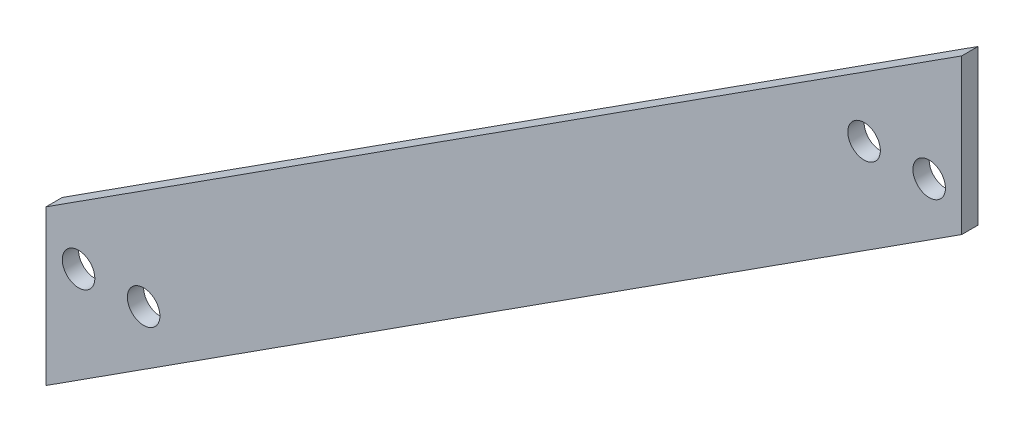
ISO-10303-21;
HEADER;
FILE_DESCRIPTION(('STEP AP214'),'2;1');
FILE_NAME('part.step','',(''),(''),'','','');
FILE_SCHEMA(('AUTOMOTIVE_DESIGN { 1 0 10303 214 1 1 1 1 }'));
ENDSEC;
DATA;
#1=APPLICATION_CONTEXT('core data for automotive mechanical design processes');
#2=APPLICATION_PROTOCOL_DEFINITION('international standard','automotive_design',2000,#1);
#3=PRODUCT_CONTEXT('',#1,'mechanical');
#4=PRODUCT('Part','Part','',(#3));
#5=PRODUCT_RELATED_PRODUCT_CATEGORY('part','',(#4));
#6=PRODUCT_DEFINITION_FORMATION('','',#4);
#7=PRODUCT_DEFINITION_CONTEXT('part definition',#1,'design');
#8=PRODUCT_DEFINITION('design','',#6,#7);
#9=PRODUCT_DEFINITION_SHAPE('','',#8);
#10=(LENGTH_UNIT() NAMED_UNIT(*) SI_UNIT(.MILLI.,.METRE.));
#11=(NAMED_UNIT(*) PLANE_ANGLE_UNIT() SI_UNIT($,.RADIAN.));
#12=(NAMED_UNIT(*) SI_UNIT($,.STERADIAN.) SOLID_ANGLE_UNIT());
#13=UNCERTAINTY_MEASURE_WITH_UNIT(LENGTH_MEASURE(1.E-05),#10,'distance_accuracy_value','');
#14=(GEOMETRIC_REPRESENTATION_CONTEXT(3) GLOBAL_UNCERTAINTY_ASSIGNED_CONTEXT((#13)) GLOBAL_UNIT_ASSIGNED_CONTEXT((#10,
#11,#12)) REPRESENTATION_CONTEXT('',''));
#15=CARTESIAN_POINT('',(0.,0.,0.));
#16=DIRECTION('',(0.,0.,1.));
#17=DIRECTION('',(1.,0.,0.));
#18=AXIS2_PLACEMENT_3D('',#15,#16,#17);
#19=CARTESIAN_POINT('',(0.,0.,4.7625));
#20=DIRECTION('',(0.,0.,1.));
#21=DIRECTION('',(1.,0.,0.));
#22=AXIS2_PLACEMENT_3D('',#19,#20,#21);
#23=PLANE('',#22);
#24=CARTESIAN_POINT('',(239.395,136.318636406188,4.7625));
#25=DIRECTION('',(0.,0.,1.));
#26=DIRECTION('',(1.,0.,0.));
#27=AXIS2_PLACEMENT_3D('',#24,#25,#26);
#28=CIRCLE('',#27,4.76250000000001);
#29=CARTESIAN_POINT('',(234.6325,136.318636406188,4.7625));
#30=VERTEX_POINT('',#29);
#31=EDGE_CURVE('E156',#30,#30,#28,.T.);
#32=ORIENTED_EDGE('',*,*,#31,.F.);
#33=EDGE_LOOP('',(#32));
#34=FACE_BOUND('',#33,.T.);
#35=CARTESIAN_POINT('',(9.525,-11.0013635938122,4.7625));
#36=DIRECTION('',(0.,0.,1.));
#37=DIRECTION('',(1.,0.,0.));
#38=AXIS2_PLACEMENT_3D('',#35,#36,#37);
#39=CIRCLE('',#38,4.76250000000001);
#40=CARTESIAN_POINT('',(4.76249999999999,-11.0013635938122,4.7625));
#41=VERTEX_POINT('',#40);
#42=EDGE_CURVE('E122',#41,#41,#39,.T.);
#43=ORIENTED_EDGE('',*,*,#42,.F.);
#44=EDGE_LOOP('',(#43));
#45=FACE_BOUND('',#44,.T.);
#46=DIRECTION('',(-0.841219980517551,-0.540693022313079,0.));
#47=VECTOR('',#46,1.);
#48=CARTESIAN_POINT('',(267.97,172.237360672406,4.7625));
#49=LINE('',#48,#47);
#50=CARTESIAN_POINT('',(267.97,172.237360672406,4.7625));
#51=VERTEX_POINT('',#50);
#52=CARTESIAN_POINT('',(0.,0.,4.7625));
#53=VERTEX_POINT('',#52);
#54=EDGE_CURVE('E100',#51,#53,#49,.T.);
#55=ORIENTED_EDGE('',*,*,#54,.T.);
#56=DIRECTION('',(0.,-1.,0.));
#57=VECTOR('',#56,1.);
#58=CARTESIAN_POINT('',(0.,0.,4.7625));
#59=LINE('',#58,#57);
#60=CARTESIAN_POINT('',(0.,-45.2913635938107,4.7625));
#61=VERTEX_POINT('',#60);
#62=EDGE_CURVE('E95',#53,#61,#59,.T.);
#63=ORIENTED_EDGE('',*,*,#62,.T.);
#64=DIRECTION('',(0.84121998051755,0.540693022313081,0.));
#65=VECTOR('',#64,1.);
#66=CARTESIAN_POINT('',(0.,-45.2913635938107,4.7625));
#67=LINE('',#66,#65);
#68=CARTESIAN_POINT('',(267.97,126.945997078596,4.7625));
#69=VERTEX_POINT('',#68);
#70=EDGE_CURVE('E98',#61,#69,#67,.T.);
#71=ORIENTED_EDGE('',*,*,#70,.T.);
#72=DIRECTION('',(0.,1.,0.));
#73=VECTOR('',#72,1.);
#74=CARTESIAN_POINT('',(267.97,126.945997078596,4.7625));
#75=LINE('',#74,#73);
#76=EDGE_CURVE('E65',#69,#51,#75,.T.);
#77=ORIENTED_EDGE('',*,*,#76,.T.);
#78=EDGE_LOOP('',(#55,#63,#71,#77));
#79=FACE_BOUND('',#78,.T.);
#80=CARTESIAN_POINT('',(28.575,-11.0013635938122,4.7625));
#81=DIRECTION('',(0.,0.,1.));
#82=DIRECTION('',(1.,0.,0.));
#83=AXIS2_PLACEMENT_3D('',#80,#81,#82);
#84=CIRCLE('',#83,4.76250000000001);
#85=CARTESIAN_POINT('',(23.8125,-11.0013635938122,4.7625));
#86=VERTEX_POINT('',#85);
#87=EDGE_CURVE('E148',#86,#86,#84,.T.);
#88=ORIENTED_EDGE('',*,*,#87,.F.);
#89=EDGE_LOOP('',(#88));
#90=FACE_BOUND('',#89,.T.);
#91=CARTESIAN_POINT('',(258.445,136.318636406188,4.7625));
#92=DIRECTION('',(0.,0.,1.));
#93=DIRECTION('',(1.,0.,0.));
#94=AXIS2_PLACEMENT_3D('',#91,#92,#93);
#95=CIRCLE('',#94,4.76250000000001);
#96=CARTESIAN_POINT('',(253.6825,136.318636406188,4.7625));
#97=VERTEX_POINT('',#96);
#98=EDGE_CURVE('E164',#97,#97,#95,.T.);
#99=ORIENTED_EDGE('',*,*,#98,.F.);
#100=EDGE_LOOP('',(#99));
#101=FACE_BOUND('',#100,.T.);
#102=ADVANCED_FACE('F47',(#34,#45,#79,#90,#101),#23,.T.);
#103=CARTESIAN_POINT('',(0.,0.,0.));
#104=DIRECTION('',(0.,0.,1.));
#105=DIRECTION('',(1.,0.,0.));
#106=AXIS2_PLACEMENT_3D('',#103,#104,#105);
#107=PLANE('',#106);
#108=DIRECTION('',(-0.841219980517551,-0.540693022313079,0.));
#109=VECTOR('',#108,1.);
#110=CARTESIAN_POINT('',(267.97,172.237360672406,0.));
#111=LINE('',#110,#109);
#112=CARTESIAN_POINT('',(267.97,172.237360672406,0.));
#113=VERTEX_POINT('',#112);
#114=CARTESIAN_POINT('',(0.,0.,0.));
#115=VERTEX_POINT('',#114);
#116=EDGE_CURVE('E118',#113,#115,#111,.T.);
#117=ORIENTED_EDGE('',*,*,#116,.F.);
#118=DIRECTION('',(0.,1.,0.));
#119=VECTOR('',#118,1.);
#120=CARTESIAN_POINT('',(267.97,126.945997078596,0.));
#121=LINE('',#120,#119);
#122=CARTESIAN_POINT('',(267.97,126.945997078596,0.));
#123=VERTEX_POINT('',#122);
#124=EDGE_CURVE('E88',#123,#113,#121,.T.);
#125=ORIENTED_EDGE('',*,*,#124,.F.);
#126=DIRECTION('',(0.84121998051755,0.540693022313081,0.));
#127=VECTOR('',#126,1.);
#128=CARTESIAN_POINT('',(0.,-45.2913635938107,0.));
#129=LINE('',#128,#127);
#130=CARTESIAN_POINT('',(0.,-45.2913635938107,0.));
#131=VERTEX_POINT('',#130);
#132=EDGE_CURVE('E82',#131,#123,#129,.T.);
#133=ORIENTED_EDGE('',*,*,#132,.F.);
#134=DIRECTION('',(0.,-1.,0.));
#135=VECTOR('',#134,1.);
#136=CARTESIAN_POINT('',(0.,0.,0.));
#137=LINE('',#136,#135);
#138=EDGE_CURVE('E105',#115,#131,#137,.T.);
#139=ORIENTED_EDGE('',*,*,#138,.F.);
#140=EDGE_LOOP('',(#117,#125,#133,#139));
#141=FACE_BOUND('',#140,.T.);
#142=CARTESIAN_POINT('',(9.525,-11.0013635938122,0.));
#143=DIRECTION('',(0.,0.,1.));
#144=DIRECTION('',(1.,0.,0.));
#145=AXIS2_PLACEMENT_3D('',#142,#143,#144);
#146=CIRCLE('',#145,4.76250000000001);
#147=CARTESIAN_POINT('',(4.76249999999999,-11.0013635938122,0.));
#148=VERTEX_POINT('',#147);
#149=EDGE_CURVE('E144',#148,#148,#146,.T.);
#150=ORIENTED_EDGE('',*,*,#149,.T.);
#151=EDGE_LOOP('',(#150));
#152=FACE_BOUND('',#151,.T.);
#153=CARTESIAN_POINT('',(28.575,-11.0013635938122,0.));
#154=DIRECTION('',(0.,0.,1.));
#155=DIRECTION('',(1.,0.,0.));
#156=AXIS2_PLACEMENT_3D('',#153,#154,#155);
#157=CIRCLE('',#156,4.76250000000001);
#158=CARTESIAN_POINT('',(23.8125,-11.0013635938122,0.));
#159=VERTEX_POINT('',#158);
#160=EDGE_CURVE('E152',#159,#159,#157,.T.);
#161=ORIENTED_EDGE('',*,*,#160,.T.);
#162=EDGE_LOOP('',(#161));
#163=FACE_BOUND('',#162,.T.);
#164=CARTESIAN_POINT('',(239.395,136.318636406188,0.));
#165=DIRECTION('',(0.,0.,1.));
#166=DIRECTION('',(1.,0.,0.));
#167=AXIS2_PLACEMENT_3D('',#164,#165,#166);
#168=CIRCLE('',#167,4.76250000000001);
#169=CARTESIAN_POINT('',(234.6325,136.318636406188,0.));
#170=VERTEX_POINT('',#169);
#171=EDGE_CURVE('E160',#170,#170,#168,.T.);
#172=ORIENTED_EDGE('',*,*,#171,.T.);
#173=EDGE_LOOP('',(#172));
#174=FACE_BOUND('',#173,.T.);
#175=CARTESIAN_POINT('',(258.445,136.318636406188,0.));
#176=DIRECTION('',(0.,0.,1.));
#177=DIRECTION('',(1.,0.,0.));
#178=AXIS2_PLACEMENT_3D('',#175,#176,#177);
#179=CIRCLE('',#178,4.76250000000001);
#180=CARTESIAN_POINT('',(253.6825,136.318636406188,0.));
#181=VERTEX_POINT('',#180);
#182=EDGE_CURVE('E168',#181,#181,#179,.T.);
#183=ORIENTED_EDGE('',*,*,#182,.T.);
#184=EDGE_LOOP('',(#183));
#185=FACE_BOUND('',#184,.T.);
#186=ADVANCED_FACE('F137',(#141,#152,#163,#174,#185),#107,.F.);
#187=CARTESIAN_POINT('',(267.97,172.237360672406,4.7625));
#188=DIRECTION('',(0.540693022313079,-0.841219980517551,0.));
#189=DIRECTION('',(0.841219980517551,0.540693022313079,0.));
#190=AXIS2_PLACEMENT_3D('',#187,#188,#189);
#191=PLANE('',#190);
#192=ORIENTED_EDGE('',*,*,#116,.T.);
#193=DIRECTION('',(0.,0.,-1.));
#194=VECTOR('',#193,1.);
#195=CARTESIAN_POINT('',(0.,0.,4.7625));
#196=LINE('',#195,#194);
#197=EDGE_CURVE('E11',#53,#115,#196,.T.);
#198=ORIENTED_EDGE('',*,*,#197,.F.);
#199=ORIENTED_EDGE('',*,*,#54,.F.);
#200=DIRECTION('',(0.,0.,-1.));
#201=VECTOR('',#200,1.);
#202=CARTESIAN_POINT('',(267.97,172.237360672406,4.7625));
#203=LINE('',#202,#201);
#204=EDGE_CURVE('E114',#51,#113,#203,.T.);
#205=ORIENTED_EDGE('',*,*,#204,.T.);
#206=EDGE_LOOP('',(#192,#198,#199,#205));
#207=FACE_BOUND('',#206,.T.);
#208=ADVANCED_FACE('F49',(#207),#191,.F.);
#209=CARTESIAN_POINT('',(0.,0.,4.7625));
#210=DIRECTION('',(1.,0.,0.));
#211=DIRECTION('',(0.,1.,0.));
#212=AXIS2_PLACEMENT_3D('',#209,#210,#211);
#213=PLANE('',#212);
#214=ORIENTED_EDGE('',*,*,#138,.T.);
#215=DIRECTION('',(0.,0.,-1.));
#216=VECTOR('',#215,1.);
#217=CARTESIAN_POINT('',(0.,-45.2913635938107,4.7625));
#218=LINE('',#217,#216);
#219=EDGE_CURVE('E57',#61,#131,#218,.T.);
#220=ORIENTED_EDGE('',*,*,#219,.F.);
#221=ORIENTED_EDGE('',*,*,#62,.F.);
#222=ORIENTED_EDGE('',*,*,#197,.T.);
#223=EDGE_LOOP('',(#214,#220,#221,#222));
#224=FACE_BOUND('',#223,.T.);
#225=ADVANCED_FACE('F104',(#224),#213,.F.);
#226=CARTESIAN_POINT('',(0.,-45.2913635938107,4.7625));
#227=DIRECTION('',(-0.540693022313081,0.84121998051755,0.));
#228=DIRECTION('',(-0.84121998051755,-0.540693022313081,0.));
#229=AXIS2_PLACEMENT_3D('',#226,#227,#228);
#230=PLANE('',#229);
#231=ORIENTED_EDGE('',*,*,#132,.T.);
#232=DIRECTION('',(0.,0.,-1.));
#233=VECTOR('',#232,1.);
#234=CARTESIAN_POINT('',(267.97,126.945997078596,4.7625));
#235=LINE('',#234,#233);
#236=EDGE_CURVE('E107',#69,#123,#235,.T.);
#237=ORIENTED_EDGE('',*,*,#236,.F.);
#238=ORIENTED_EDGE('',*,*,#70,.F.);
#239=ORIENTED_EDGE('',*,*,#219,.T.);
#240=EDGE_LOOP('',(#231,#237,#238,#239));
#241=FACE_BOUND('',#240,.T.);
#242=ADVANCED_FACE('F108',(#241),#230,.F.);
#243=CARTESIAN_POINT('',(267.97,126.945997078596,4.7625));
#244=DIRECTION('',(-1.,0.,0.));
#245=DIRECTION('',(0.,-1.,0.));
#246=AXIS2_PLACEMENT_3D('',#243,#244,#245);
#247=PLANE('',#246);
#248=ORIENTED_EDGE('',*,*,#124,.T.);
#249=ORIENTED_EDGE('',*,*,#204,.F.);
#250=ORIENTED_EDGE('',*,*,#76,.F.);
#251=ORIENTED_EDGE('',*,*,#236,.T.);
#252=EDGE_LOOP('',(#248,#249,#250,#251));
#253=FACE_BOUND('',#252,.T.);
#254=ADVANCED_FACE('F134',(#253),#247,.F.);
#255=CARTESIAN_POINT('',(9.525,-11.0013635938122,4.7625));
#256=DIRECTION('',(0.,0.,-1.));
#257=DIRECTION('',(-1.,0.,0.));
#258=AXIS2_PLACEMENT_3D('',#255,#256,#257);
#259=CYLINDRICAL_SURFACE('',#258,4.76250000000001);
#260=CARTESIAN_POINT('',(4.76249999999999,-11.0013635938122,4.7625));
#261=CARTESIAN_POINT('',(4.76249999999999,-11.0013635938122,4.712890625));
#262=CARTESIAN_POINT('',(4.76249999999999,-11.0013635938122,4.66328125));
#263=CARTESIAN_POINT('',(4.76249999999999,-11.0013635938122,4.5640625));
#264=CARTESIAN_POINT('',(4.76249999999999,-11.0013635938122,4.514453125));
#265=CARTESIAN_POINT('',(4.76249999999999,-11.0013635938122,4.415234375));
#266=CARTESIAN_POINT('',(4.76249999999999,-11.0013635938122,4.365625));
#267=CARTESIAN_POINT('',(4.76249999999999,-11.0013635938122,4.26640625));
#268=CARTESIAN_POINT('',(4.76249999999999,-11.0013635938122,4.216796875));
#269=CARTESIAN_POINT('',(4.76249999999999,-11.0013635938122,4.117578125));
#270=CARTESIAN_POINT('',(4.76249999999999,-11.0013635938122,4.06796875));
#271=CARTESIAN_POINT('',(4.76249999999999,-11.0013635938122,3.96875));
#272=CARTESIAN_POINT('',(4.76249999999999,-11.0013635938122,3.919140625));
#273=CARTESIAN_POINT('',(4.76249999999999,-11.0013635938122,3.819921875));
#274=CARTESIAN_POINT('',(4.76249999999999,-11.0013635938122,3.7703125));
#275=CARTESIAN_POINT('',(4.76249999999999,-11.0013635938122,3.67109375));
#276=CARTESIAN_POINT('',(4.76249999999999,-11.0013635938122,3.621484375));
#277=CARTESIAN_POINT('',(4.76249999999999,-11.0013635938122,3.522265625));
#278=CARTESIAN_POINT('',(4.76249999999999,-11.0013635938122,3.47265625));
#279=CARTESIAN_POINT('',(4.76249999999999,-11.0013635938122,3.3734375));
#280=CARTESIAN_POINT('',(4.76249999999999,-11.0013635938122,3.323828125));
#281=CARTESIAN_POINT('',(4.76249999999999,-11.0013635938122,3.224609375));
#282=CARTESIAN_POINT('',(4.76249999999999,-11.0013635938122,3.175));
#283=CARTESIAN_POINT('',(4.76249999999999,-11.0013635938122,3.07578125));
#284=CARTESIAN_POINT('',(4.76249999999999,-11.0013635938122,3.026171875));
#285=CARTESIAN_POINT('',(4.76249999999999,-11.0013635938122,2.926953125));
#286=CARTESIAN_POINT('',(4.76249999999999,-11.0013635938122,2.87734375));
#287=CARTESIAN_POINT('',(4.76249999999999,-11.0013635938122,2.778125));
#288=CARTESIAN_POINT('',(4.76249999999999,-11.0013635938122,2.728515625));
#289=CARTESIAN_POINT('',(4.76249999999999,-11.0013635938122,2.629296875));
#290=CARTESIAN_POINT('',(4.76249999999999,-11.0013635938122,2.5796875));
#291=CARTESIAN_POINT('',(4.76249999999999,-11.0013635938122,2.48046875));
#292=CARTESIAN_POINT('',(4.76249999999999,-11.0013635938122,2.430859375));
#293=CARTESIAN_POINT('',(4.76249999999999,-11.0013635938122,2.331640625));
#294=CARTESIAN_POINT('',(4.76249999999999,-11.0013635938122,2.28203125));
#295=CARTESIAN_POINT('',(4.76249999999999,-11.0013635938122,2.1828125));
#296=CARTESIAN_POINT('',(4.76249999999999,-11.0013635938122,2.133203125));
#297=CARTESIAN_POINT('',(4.76249999999999,-11.0013635938122,2.033984375));
#298=CARTESIAN_POINT('',(4.76249999999999,-11.0013635938122,1.984375));
#299=CARTESIAN_POINT('',(4.76249999999999,-11.0013635938122,1.88515625));
#300=CARTESIAN_POINT('',(4.76249999999999,-11.0013635938122,1.835546875));
#301=CARTESIAN_POINT('',(4.76249999999999,-11.0013635938122,1.736328125));
#302=CARTESIAN_POINT('',(4.76249999999999,-11.0013635938122,1.68671875));
#303=CARTESIAN_POINT('',(4.76249999999999,-11.0013635938122,1.5875));
#304=CARTESIAN_POINT('',(4.76249999999999,-11.0013635938122,1.537890625));
#305=CARTESIAN_POINT('',(4.76249999999999,-11.0013635938122,1.438671875));
#306=CARTESIAN_POINT('',(4.76249999999999,-11.0013635938122,1.3890625));
#307=CARTESIAN_POINT('',(4.76249999999999,-11.0013635938122,1.28984375));
#308=CARTESIAN_POINT('',(4.76249999999999,-11.0013635938122,1.240234375));
#309=CARTESIAN_POINT('',(4.76249999999999,-11.0013635938122,1.141015625));
#310=CARTESIAN_POINT('',(4.76249999999999,-11.0013635938122,1.09140625));
#311=CARTESIAN_POINT('',(4.76249999999999,-11.0013635938122,0.992187499999999));
#312=CARTESIAN_POINT('',(4.76249999999999,-11.0013635938122,0.942578124999999));
#313=CARTESIAN_POINT('',(4.76249999999999,-11.0013635938122,0.843359375));
#314=CARTESIAN_POINT('',(4.76249999999999,-11.0013635938122,0.79375));
#315=CARTESIAN_POINT('',(4.76249999999999,-11.0013635938122,0.69453125));
#316=CARTESIAN_POINT('',(4.76249999999999,-11.0013635938122,0.644921875));
#317=CARTESIAN_POINT('',(4.76249999999999,-11.0013635938122,0.545703125));
#318=CARTESIAN_POINT('',(4.76249999999999,-11.0013635938122,0.49609375));
#319=CARTESIAN_POINT('',(4.76249999999999,-11.0013635938122,0.396875));
#320=CARTESIAN_POINT('',(4.76249999999999,-11.0013635938122,0.347265625));
#321=CARTESIAN_POINT('',(4.76249999999999,-11.0013635938122,0.248046875));
#322=CARTESIAN_POINT('',(4.76249999999999,-11.0013635938122,0.1984375));
#323=CARTESIAN_POINT('',(4.76249999999999,-11.0013635938122,0.09921875));
#324=CARTESIAN_POINT('',(4.76249999999999,-11.0013635938122,0.049609375));
#325=CARTESIAN_POINT('',(4.76249999999999,-11.0013635938122,0.));
#326=B_SPLINE_CURVE_WITH_KNOTS('',3,(#260,#261,#262,#263,#264,#265,#266,#267,#268,#269,#270,
#271,#272,#273,#274,#275,#276,#277,#278,#279,#280,#281,#282,#283,#284,#285,#286,#287,#288,#289,
#290,#291,#292,#293,#294,#295,#296,#297,#298,#299,#300,#301,#302,#303,#304,#305,#306,#307,#308,
#309,#310,#311,#312,#313,#314,#315,#316,#317,#318,#319,#320,#321,#322,#323,#324,#325),
.UNSPECIFIED.,.F.,.F.,(4,2,2,2,2,2,2,2,2,2,2,2,2,2,2,2,2,2,2,2,2,2,2,2,2,2,2,2,2,2,2,2,4),(0.,
0.148828125,0.29765625,0.446484375,0.5953125,0.744140625,0.892968750000001,1.041796875,1.190625,
1.339453125,1.48828125,1.637109375,1.7859375,1.934765625,2.08359375,2.232421875,2.38125,
2.530078125,2.67890625,2.827734375,2.9765625,3.125390625,3.27421875,3.423046875,3.571875,
3.720703125,3.86953125,4.018359375,4.1671875,4.316015625,4.46484375,4.613671875,4.7625),.UNSPECIFIED.);
#327=EDGE_CURVE('BSEAM191',#41,#148,#326,.T.);
#328=ORIENTED_EDGE('',*,*,#42,.T.);
#329=ORIENTED_EDGE('',*,*,#149,.F.);
#330=ORIENTED_EDGE('',*,*,#327,.T.);
#331=ORIENTED_EDGE('',*,*,#327,.F.);
#332=EDGE_LOOP('',(#328,#330,#329,#331));
#333=FACE_BOUND('',#332,.T.);
#334=ADVANCED_FACE('F191',(#333),#259,.F.);
#335=CARTESIAN_POINT('',(28.575,-11.0013635938122,4.7625));
#336=DIRECTION('',(0.,0.,-1.));
#337=DIRECTION('',(-1.,0.,0.));
#338=AXIS2_PLACEMENT_3D('',#335,#336,#337);
#339=CYLINDRICAL_SURFACE('',#338,4.76250000000001);
#340=CARTESIAN_POINT('',(23.8125,-11.0013635938122,4.7625));
#341=CARTESIAN_POINT('',(23.8125,-11.0013635938122,4.712890625));
#342=CARTESIAN_POINT('',(23.8125,-11.0013635938122,4.66328125));
#343=CARTESIAN_POINT('',(23.8125,-11.0013635938122,4.5640625));
#344=CARTESIAN_POINT('',(23.8125,-11.0013635938122,4.514453125));
#345=CARTESIAN_POINT('',(23.8125,-11.0013635938122,4.415234375));
#346=CARTESIAN_POINT('',(23.8125,-11.0013635938122,4.365625));
#347=CARTESIAN_POINT('',(23.8125,-11.0013635938122,4.26640625));
#348=CARTESIAN_POINT('',(23.8125,-11.0013635938122,4.216796875));
#349=CARTESIAN_POINT('',(23.8125,-11.0013635938122,4.117578125));
#350=CARTESIAN_POINT('',(23.8125,-11.0013635938122,4.06796875));
#351=CARTESIAN_POINT('',(23.8125,-11.0013635938122,3.96875));
#352=CARTESIAN_POINT('',(23.8125,-11.0013635938122,3.919140625));
#353=CARTESIAN_POINT('',(23.8125,-11.0013635938122,3.819921875));
#354=CARTESIAN_POINT('',(23.8125,-11.0013635938122,3.7703125));
#355=CARTESIAN_POINT('',(23.8125,-11.0013635938122,3.67109375));
#356=CARTESIAN_POINT('',(23.8125,-11.0013635938122,3.621484375));
#357=CARTESIAN_POINT('',(23.8125,-11.0013635938122,3.522265625));
#358=CARTESIAN_POINT('',(23.8125,-11.0013635938122,3.47265625));
#359=CARTESIAN_POINT('',(23.8125,-11.0013635938122,3.3734375));
#360=CARTESIAN_POINT('',(23.8125,-11.0013635938122,3.323828125));
#361=CARTESIAN_POINT('',(23.8125,-11.0013635938122,3.224609375));
#362=CARTESIAN_POINT('',(23.8125,-11.0013635938122,3.175));
#363=CARTESIAN_POINT('',(23.8125,-11.0013635938122,3.07578125));
#364=CARTESIAN_POINT('',(23.8125,-11.0013635938122,3.026171875));
#365=CARTESIAN_POINT('',(23.8125,-11.0013635938122,2.926953125));
#366=CARTESIAN_POINT('',(23.8125,-11.0013635938122,2.87734375));
#367=CARTESIAN_POINT('',(23.8125,-11.0013635938122,2.778125));
#368=CARTESIAN_POINT('',(23.8125,-11.0013635938122,2.728515625));
#369=CARTESIAN_POINT('',(23.8125,-11.0013635938122,2.629296875));
#370=CARTESIAN_POINT('',(23.8125,-11.0013635938122,2.5796875));
#371=CARTESIAN_POINT('',(23.8125,-11.0013635938122,2.48046875));
#372=CARTESIAN_POINT('',(23.8125,-11.0013635938122,2.430859375));
#373=CARTESIAN_POINT('',(23.8125,-11.0013635938122,2.331640625));
#374=CARTESIAN_POINT('',(23.8125,-11.0013635938122,2.28203125));
#375=CARTESIAN_POINT('',(23.8125,-11.0013635938122,2.1828125));
#376=CARTESIAN_POINT('',(23.8125,-11.0013635938122,2.133203125));
#377=CARTESIAN_POINT('',(23.8125,-11.0013635938122,2.033984375));
#378=CARTESIAN_POINT('',(23.8125,-11.0013635938122,1.984375));
#379=CARTESIAN_POINT('',(23.8125,-11.0013635938122,1.88515625));
#380=CARTESIAN_POINT('',(23.8125,-11.0013635938122,1.835546875));
#381=CARTESIAN_POINT('',(23.8125,-11.0013635938122,1.736328125));
#382=CARTESIAN_POINT('',(23.8125,-11.0013635938122,1.68671875));
#383=CARTESIAN_POINT('',(23.8125,-11.0013635938122,1.5875));
#384=CARTESIAN_POINT('',(23.8125,-11.0013635938122,1.537890625));
#385=CARTESIAN_POINT('',(23.8125,-11.0013635938122,1.438671875));
#386=CARTESIAN_POINT('',(23.8125,-11.0013635938122,1.3890625));
#387=CARTESIAN_POINT('',(23.8125,-11.0013635938122,1.28984375));
#388=CARTESIAN_POINT('',(23.8125,-11.0013635938122,1.240234375));
#389=CARTESIAN_POINT('',(23.8125,-11.0013635938122,1.141015625));
#390=CARTESIAN_POINT('',(23.8125,-11.0013635938122,1.09140625));
#391=CARTESIAN_POINT('',(23.8125,-11.0013635938122,0.992187499999999));
#392=CARTESIAN_POINT('',(23.8125,-11.0013635938122,0.942578124999999));
#393=CARTESIAN_POINT('',(23.8125,-11.0013635938122,0.843359375));
#394=CARTESIAN_POINT('',(23.8125,-11.0013635938122,0.79375));
#395=CARTESIAN_POINT('',(23.8125,-11.0013635938122,0.69453125));
#396=CARTESIAN_POINT('',(23.8125,-11.0013635938122,0.644921875));
#397=CARTESIAN_POINT('',(23.8125,-11.0013635938122,0.545703125));
#398=CARTESIAN_POINT('',(23.8125,-11.0013635938122,0.49609375));
#399=CARTESIAN_POINT('',(23.8125,-11.0013635938122,0.396875));
#400=CARTESIAN_POINT('',(23.8125,-11.0013635938122,0.347265625));
#401=CARTESIAN_POINT('',(23.8125,-11.0013635938122,0.248046875));
#402=CARTESIAN_POINT('',(23.8125,-11.0013635938122,0.1984375));
#403=CARTESIAN_POINT('',(23.8125,-11.0013635938122,0.09921875));
#404=CARTESIAN_POINT('',(23.8125,-11.0013635938122,0.049609375));
#405=CARTESIAN_POINT('',(23.8125,-11.0013635938122,0.));
#406=B_SPLINE_CURVE_WITH_KNOTS('',3,(#340,#341,#342,#343,#344,#345,#346,#347,#348,#349,#350,
#351,#352,#353,#354,#355,#356,#357,#358,#359,#360,#361,#362,#363,#364,#365,#366,#367,#368,#369,
#370,#371,#372,#373,#374,#375,#376,#377,#378,#379,#380,#381,#382,#383,#384,#385,#386,#387,#388,
#389,#390,#391,#392,#393,#394,#395,#396,#397,#398,#399,#400,#401,#402,#403,#404,#405),
.UNSPECIFIED.,.F.,.F.,(4,2,2,2,2,2,2,2,2,2,2,2,2,2,2,2,2,2,2,2,2,2,2,2,2,2,2,2,2,2,2,2,4),(0.,
0.148828125,0.29765625,0.446484375,0.5953125,0.744140625,0.892968750000001,1.041796875,1.190625,
1.339453125,1.48828125,1.637109375,1.7859375,1.934765625,2.08359375,2.232421875,2.38125,
2.530078125,2.67890625,2.827734375,2.9765625,3.125390625,3.27421875,3.423046875,3.571875,
3.720703125,3.86953125,4.018359375,4.1671875,4.316015625,4.46484375,4.613671875,4.7625),.UNSPECIFIED.);
#407=EDGE_CURVE('BSEAM245',#86,#159,#406,.T.);
#408=ORIENTED_EDGE('',*,*,#87,.T.);
#409=ORIENTED_EDGE('',*,*,#160,.F.);
#410=ORIENTED_EDGE('',*,*,#407,.T.);
#411=ORIENTED_EDGE('',*,*,#407,.F.);
#412=EDGE_LOOP('',(#408,#410,#409,#411));
#413=FACE_BOUND('',#412,.T.);
#414=ADVANCED_FACE('F245',(#413),#339,.F.);
#415=CARTESIAN_POINT('',(239.395,136.318636406188,4.7625));
#416=DIRECTION('',(0.,0.,-1.));
#417=DIRECTION('',(-1.,0.,0.));
#418=AXIS2_PLACEMENT_3D('',#415,#416,#417);
#419=CYLINDRICAL_SURFACE('',#418,4.76250000000001);
#420=CARTESIAN_POINT('',(234.6325,136.318636406188,4.7625));
#421=CARTESIAN_POINT('',(234.6325,136.318636406188,4.712890625));
#422=CARTESIAN_POINT('',(234.6325,136.318636406188,4.66328125));
#423=CARTESIAN_POINT('',(234.6325,136.318636406188,4.5640625));
#424=CARTESIAN_POINT('',(234.6325,136.318636406188,4.514453125));
#425=CARTESIAN_POINT('',(234.6325,136.318636406188,4.415234375));
#426=CARTESIAN_POINT('',(234.6325,136.318636406188,4.365625));
#427=CARTESIAN_POINT('',(234.6325,136.318636406188,4.26640625));
#428=CARTESIAN_POINT('',(234.6325,136.318636406188,4.216796875));
#429=CARTESIAN_POINT('',(234.6325,136.318636406188,4.117578125));
#430=CARTESIAN_POINT('',(234.6325,136.318636406188,4.06796875));
#431=CARTESIAN_POINT('',(234.6325,136.318636406188,3.96875));
#432=CARTESIAN_POINT('',(234.6325,136.318636406188,3.919140625));
#433=CARTESIAN_POINT('',(234.6325,136.318636406188,3.819921875));
#434=CARTESIAN_POINT('',(234.6325,136.318636406188,3.7703125));
#435=CARTESIAN_POINT('',(234.6325,136.318636406188,3.67109375));
#436=CARTESIAN_POINT('',(234.6325,136.318636406188,3.621484375));
#437=CARTESIAN_POINT('',(234.6325,136.318636406188,3.522265625));
#438=CARTESIAN_POINT('',(234.6325,136.318636406188,3.47265625));
#439=CARTESIAN_POINT('',(234.6325,136.318636406188,3.3734375));
#440=CARTESIAN_POINT('',(234.6325,136.318636406188,3.323828125));
#441=CARTESIAN_POINT('',(234.6325,136.318636406188,3.224609375));
#442=CARTESIAN_POINT('',(234.6325,136.318636406188,3.175));
#443=CARTESIAN_POINT('',(234.6325,136.318636406188,3.07578125));
#444=CARTESIAN_POINT('',(234.6325,136.318636406188,3.026171875));
#445=CARTESIAN_POINT('',(234.6325,136.318636406188,2.926953125));
#446=CARTESIAN_POINT('',(234.6325,136.318636406188,2.87734375));
#447=CARTESIAN_POINT('',(234.6325,136.318636406188,2.778125));
#448=CARTESIAN_POINT('',(234.6325,136.318636406188,2.728515625));
#449=CARTESIAN_POINT('',(234.6325,136.318636406188,2.629296875));
#450=CARTESIAN_POINT('',(234.6325,136.318636406188,2.5796875));
#451=CARTESIAN_POINT('',(234.6325,136.318636406188,2.48046875));
#452=CARTESIAN_POINT('',(234.6325,136.318636406188,2.430859375));
#453=CARTESIAN_POINT('',(234.6325,136.318636406188,2.331640625));
#454=CARTESIAN_POINT('',(234.6325,136.318636406188,2.28203125));
#455=CARTESIAN_POINT('',(234.6325,136.318636406188,2.1828125));
#456=CARTESIAN_POINT('',(234.6325,136.318636406188,2.133203125));
#457=CARTESIAN_POINT('',(234.6325,136.318636406188,2.033984375));
#458=CARTESIAN_POINT('',(234.6325,136.318636406188,1.984375));
#459=CARTESIAN_POINT('',(234.6325,136.318636406188,1.88515625));
#460=CARTESIAN_POINT('',(234.6325,136.318636406188,1.835546875));
#461=CARTESIAN_POINT('',(234.6325,136.318636406188,1.736328125));
#462=CARTESIAN_POINT('',(234.6325,136.318636406188,1.68671875));
#463=CARTESIAN_POINT('',(234.6325,136.318636406188,1.5875));
#464=CARTESIAN_POINT('',(234.6325,136.318636406188,1.537890625));
#465=CARTESIAN_POINT('',(234.6325,136.318636406188,1.438671875));
#466=CARTESIAN_POINT('',(234.6325,136.318636406188,1.3890625));
#467=CARTESIAN_POINT('',(234.6325,136.318636406188,1.28984375));
#468=CARTESIAN_POINT('',(234.6325,136.318636406188,1.240234375));
#469=CARTESIAN_POINT('',(234.6325,136.318636406188,1.141015625));
#470=CARTESIAN_POINT('',(234.6325,136.318636406188,1.09140625));
#471=CARTESIAN_POINT('',(234.6325,136.318636406188,0.992187499999999));
#472=CARTESIAN_POINT('',(234.6325,136.318636406188,0.942578124999999));
#473=CARTESIAN_POINT('',(234.6325,136.318636406188,0.843359375));
#474=CARTESIAN_POINT('',(234.6325,136.318636406188,0.79375));
#475=CARTESIAN_POINT('',(234.6325,136.318636406188,0.69453125));
#476=CARTESIAN_POINT('',(234.6325,136.318636406188,0.644921875));
#477=CARTESIAN_POINT('',(234.6325,136.318636406188,0.545703125));
#478=CARTESIAN_POINT('',(234.6325,136.318636406188,0.49609375));
#479=CARTESIAN_POINT('',(234.6325,136.318636406188,0.396875));
#480=CARTESIAN_POINT('',(234.6325,136.318636406188,0.347265625));
#481=CARTESIAN_POINT('',(234.6325,136.318636406188,0.248046875));
#482=CARTESIAN_POINT('',(234.6325,136.318636406188,0.1984375));
#483=CARTESIAN_POINT('',(234.6325,136.318636406188,0.09921875));
#484=CARTESIAN_POINT('',(234.6325,136.318636406188,0.049609375));
#485=CARTESIAN_POINT('',(234.6325,136.318636406188,0.));
#486=B_SPLINE_CURVE_WITH_KNOTS('',3,(#420,#421,#422,#423,#424,#425,#426,#427,#428,#429,#430,
#431,#432,#433,#434,#435,#436,#437,#438,#439,#440,#441,#442,#443,#444,#445,#446,#447,#448,#449,
#450,#451,#452,#453,#454,#455,#456,#457,#458,#459,#460,#461,#462,#463,#464,#465,#466,#467,#468,
#469,#470,#471,#472,#473,#474,#475,#476,#477,#478,#479,#480,#481,#482,#483,#484,#485),
.UNSPECIFIED.,.F.,.F.,(4,2,2,2,2,2,2,2,2,2,2,2,2,2,2,2,2,2,2,2,2,2,2,2,2,2,2,2,2,2,2,2,4),(0.,
0.148828125,0.29765625,0.446484375,0.5953125,0.744140625,0.892968750000001,1.041796875,1.190625,
1.339453125,1.48828125,1.637109375,1.7859375,1.934765625,2.08359375,2.232421875,2.38125,
2.530078125,2.67890625,2.827734375,2.9765625,3.125390625,3.27421875,3.423046875,3.571875,
3.720703125,3.86953125,4.018359375,4.1671875,4.316015625,4.46484375,4.613671875,4.7625),.UNSPECIFIED.);
#487=EDGE_CURVE('BSEAM254',#30,#170,#486,.T.);
#488=ORIENTED_EDGE('',*,*,#31,.T.);
#489=ORIENTED_EDGE('',*,*,#171,.F.);
#490=ORIENTED_EDGE('',*,*,#487,.T.);
#491=ORIENTED_EDGE('',*,*,#487,.F.);
#492=EDGE_LOOP('',(#488,#490,#489,#491));
#493=FACE_BOUND('',#492,.T.);
#494=ADVANCED_FACE('F254',(#493),#419,.F.);
#495=CARTESIAN_POINT('',(258.445,136.318636406188,4.7625));
#496=DIRECTION('',(0.,0.,-1.));
#497=DIRECTION('',(-1.,0.,0.));
#498=AXIS2_PLACEMENT_3D('',#495,#496,#497);
#499=CYLINDRICAL_SURFACE('',#498,4.76250000000001);
#500=CARTESIAN_POINT('',(253.6825,136.318636406188,4.7625));
#501=CARTESIAN_POINT('',(253.6825,136.318636406188,4.712890625));
#502=CARTESIAN_POINT('',(253.6825,136.318636406188,4.66328125));
#503=CARTESIAN_POINT('',(253.6825,136.318636406188,4.5640625));
#504=CARTESIAN_POINT('',(253.6825,136.318636406188,4.514453125));
#505=CARTESIAN_POINT('',(253.6825,136.318636406188,4.415234375));
#506=CARTESIAN_POINT('',(253.6825,136.318636406188,4.365625));
#507=CARTESIAN_POINT('',(253.6825,136.318636406188,4.26640625));
#508=CARTESIAN_POINT('',(253.6825,136.318636406188,4.216796875));
#509=CARTESIAN_POINT('',(253.6825,136.318636406188,4.117578125));
#510=CARTESIAN_POINT('',(253.6825,136.318636406188,4.06796875));
#511=CARTESIAN_POINT('',(253.6825,136.318636406188,3.96875));
#512=CARTESIAN_POINT('',(253.6825,136.318636406188,3.919140625));
#513=CARTESIAN_POINT('',(253.6825,136.318636406188,3.819921875));
#514=CARTESIAN_POINT('',(253.6825,136.318636406188,3.7703125));
#515=CARTESIAN_POINT('',(253.6825,136.318636406188,3.67109375));
#516=CARTESIAN_POINT('',(253.6825,136.318636406188,3.621484375));
#517=CARTESIAN_POINT('',(253.6825,136.318636406188,3.522265625));
#518=CARTESIAN_POINT('',(253.6825,136.318636406188,3.47265625));
#519=CARTESIAN_POINT('',(253.6825,136.318636406188,3.3734375));
#520=CARTESIAN_POINT('',(253.6825,136.318636406188,3.323828125));
#521=CARTESIAN_POINT('',(253.6825,136.318636406188,3.224609375));
#522=CARTESIAN_POINT('',(253.6825,136.318636406188,3.175));
#523=CARTESIAN_POINT('',(253.6825,136.318636406188,3.07578125));
#524=CARTESIAN_POINT('',(253.6825,136.318636406188,3.026171875));
#525=CARTESIAN_POINT('',(253.6825,136.318636406188,2.926953125));
#526=CARTESIAN_POINT('',(253.6825,136.318636406188,2.87734375));
#527=CARTESIAN_POINT('',(253.6825,136.318636406188,2.778125));
#528=CARTESIAN_POINT('',(253.6825,136.318636406188,2.728515625));
#529=CARTESIAN_POINT('',(253.6825,136.318636406188,2.629296875));
#530=CARTESIAN_POINT('',(253.6825,136.318636406188,2.5796875));
#531=CARTESIAN_POINT('',(253.6825,136.318636406188,2.48046875));
#532=CARTESIAN_POINT('',(253.6825,136.318636406188,2.430859375));
#533=CARTESIAN_POINT('',(253.6825,136.318636406188,2.331640625));
#534=CARTESIAN_POINT('',(253.6825,136.318636406188,2.28203125));
#535=CARTESIAN_POINT('',(253.6825,136.318636406188,2.1828125));
#536=CARTESIAN_POINT('',(253.6825,136.318636406188,2.133203125));
#537=CARTESIAN_POINT('',(253.6825,136.318636406188,2.033984375));
#538=CARTESIAN_POINT('',(253.6825,136.318636406188,1.984375));
#539=CARTESIAN_POINT('',(253.6825,136.318636406188,1.88515625));
#540=CARTESIAN_POINT('',(253.6825,136.318636406188,1.835546875));
#541=CARTESIAN_POINT('',(253.6825,136.318636406188,1.736328125));
#542=CARTESIAN_POINT('',(253.6825,136.318636406188,1.68671875));
#543=CARTESIAN_POINT('',(253.6825,136.318636406188,1.5875));
#544=CARTESIAN_POINT('',(253.6825,136.318636406188,1.537890625));
#545=CARTESIAN_POINT('',(253.6825,136.318636406188,1.438671875));
#546=CARTESIAN_POINT('',(253.6825,136.318636406188,1.3890625));
#547=CARTESIAN_POINT('',(253.6825,136.318636406188,1.28984375));
#548=CARTESIAN_POINT('',(253.6825,136.318636406188,1.240234375));
#549=CARTESIAN_POINT('',(253.6825,136.318636406188,1.141015625));
#550=CARTESIAN_POINT('',(253.6825,136.318636406188,1.09140625));
#551=CARTESIAN_POINT('',(253.6825,136.318636406188,0.992187499999999));
#552=CARTESIAN_POINT('',(253.6825,136.318636406188,0.942578124999999));
#553=CARTESIAN_POINT('',(253.6825,136.318636406188,0.843359375));
#554=CARTESIAN_POINT('',(253.6825,136.318636406188,0.79375));
#555=CARTESIAN_POINT('',(253.6825,136.318636406188,0.69453125));
#556=CARTESIAN_POINT('',(253.6825,136.318636406188,0.644921875));
#557=CARTESIAN_POINT('',(253.6825,136.318636406188,0.545703125));
#558=CARTESIAN_POINT('',(253.6825,136.318636406188,0.49609375));
#559=CARTESIAN_POINT('',(253.6825,136.318636406188,0.396875));
#560=CARTESIAN_POINT('',(253.6825,136.318636406188,0.347265625));
#561=CARTESIAN_POINT('',(253.6825,136.318636406188,0.248046875));
#562=CARTESIAN_POINT('',(253.6825,136.318636406188,0.1984375));
#563=CARTESIAN_POINT('',(253.6825,136.318636406188,0.09921875));
#564=CARTESIAN_POINT('',(253.6825,136.318636406188,0.049609375));
#565=CARTESIAN_POINT('',(253.6825,136.318636406188,0.));
#566=B_SPLINE_CURVE_WITH_KNOTS('',3,(#500,#501,#502,#503,#504,#505,#506,#507,#508,#509,#510,
#511,#512,#513,#514,#515,#516,#517,#518,#519,#520,#521,#522,#523,#524,#525,#526,#527,#528,#529,
#530,#531,#532,#533,#534,#535,#536,#537,#538,#539,#540,#541,#542,#543,#544,#545,#546,#547,#548,
#549,#550,#551,#552,#553,#554,#555,#556,#557,#558,#559,#560,#561,#562,#563,#564,#565),
.UNSPECIFIED.,.F.,.F.,(4,2,2,2,2,2,2,2,2,2,2,2,2,2,2,2,2,2,2,2,2,2,2,2,2,2,2,2,2,2,2,2,4),(0.,
0.148828125,0.29765625,0.446484375,0.5953125,0.744140625,0.892968750000001,1.041796875,1.190625,
1.339453125,1.48828125,1.637109375,1.7859375,1.934765625,2.08359375,2.232421875,2.38125,
2.530078125,2.67890625,2.827734375,2.9765625,3.125390625,3.27421875,3.423046875,3.571875,
3.720703125,3.86953125,4.018359375,4.1671875,4.316015625,4.46484375,4.613671875,4.7625),.UNSPECIFIED.);
#567=EDGE_CURVE('BSEAM178',#97,#181,#566,.T.);
#568=ORIENTED_EDGE('',*,*,#98,.T.);
#569=ORIENTED_EDGE('',*,*,#182,.F.);
#570=ORIENTED_EDGE('',*,*,#567,.T.);
#571=ORIENTED_EDGE('',*,*,#567,.F.);
#572=EDGE_LOOP('',(#568,#570,#569,#571));
#573=FACE_BOUND('',#572,.T.);
#574=ADVANCED_FACE('F178',(#573),#499,.F.);
#575=CLOSED_SHELL('',(#102,#186,#208,#225,#242,#254,#334,#414,#494,#574));
#576=MANIFOLD_SOLID_BREP('B2',#575);
#577=ADVANCED_BREP_SHAPE_REPRESENTATION('',(#18,#576),#14);
#578=SHAPE_DEFINITION_REPRESENTATION(#9,#577);
ENDSEC;
END-ISO-10303-21;
